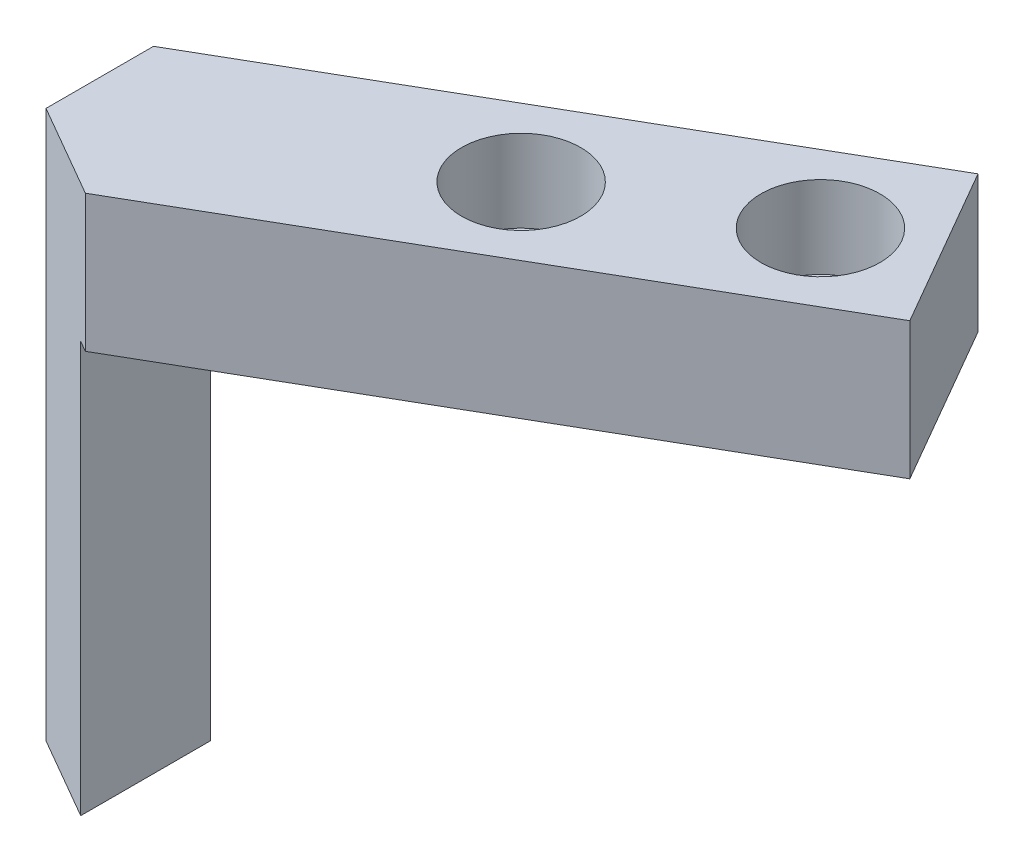
ISO-10303-21;
HEADER;
FILE_DESCRIPTION(('STEP AP214'),'2;1');
FILE_NAME('part.step','',(''),(''),'','','');
FILE_SCHEMA(('AUTOMOTIVE_DESIGN { 1 0 10303 214 1 1 1 1 }'));
ENDSEC;
DATA;
#1=APPLICATION_CONTEXT('core data for automotive mechanical design processes');
#2=APPLICATION_PROTOCOL_DEFINITION('international standard','automotive_design',2000,#1);
#3=PRODUCT_CONTEXT('',#1,'mechanical');
#4=PRODUCT('Part','Part','',(#3));
#5=PRODUCT_RELATED_PRODUCT_CATEGORY('part','',(#4));
#6=PRODUCT_DEFINITION_FORMATION('','',#4);
#7=PRODUCT_DEFINITION_CONTEXT('part definition',#1,'design');
#8=PRODUCT_DEFINITION('design','',#6,#7);
#9=PRODUCT_DEFINITION_SHAPE('','',#8);
#10=(LENGTH_UNIT() NAMED_UNIT(*) SI_UNIT(.MILLI.,.METRE.));
#11=(NAMED_UNIT(*) PLANE_ANGLE_UNIT() SI_UNIT($,.RADIAN.));
#12=(NAMED_UNIT(*) SI_UNIT($,.STERADIAN.) SOLID_ANGLE_UNIT());
#13=UNCERTAINTY_MEASURE_WITH_UNIT(LENGTH_MEASURE(1.E-05),#10,'distance_accuracy_value','');
#14=(GEOMETRIC_REPRESENTATION_CONTEXT(3) GLOBAL_UNCERTAINTY_ASSIGNED_CONTEXT((#13)) GLOBAL_UNIT_ASSIGNED_CONTEXT((#10,
#11,#12)) REPRESENTATION_CONTEXT('',''));
#15=CARTESIAN_POINT('',(0.,0.,0.));
#16=DIRECTION('',(0.,0.,1.));
#17=DIRECTION('',(1.,0.,0.));
#18=AXIS2_PLACEMENT_3D('',#15,#16,#17);
#19=CARTESIAN_POINT('',(0.,-5.,0.));
#20=DIRECTION('',(0.,1.,0.));
#21=DIRECTION('',(0.,0.,1.));
#22=AXIS2_PLACEMENT_3D('',#19,#20,#21);
#23=PLANE('',#22);
#24=CARTESIAN_POINT('',(17.9267258583379,-5.,-10.35));
#25=DIRECTION('',(0.,1.,0.));
#26=DIRECTION('',(0.,0.,1.));
#27=AXIS2_PLACEMENT_3D('',#24,#25,#26);
#28=CIRCLE('',#27,1.17500000000001);
#29=CARTESIAN_POINT('',(17.9267258583379,-5.,-9.17499999999999));
#30=VERTEX_POINT('',#29);
#31=EDGE_CURVE('E39',#30,#30,#28,.T.);
#32=ORIENTED_EDGE('',*,*,#31,.T.);
#33=EDGE_LOOP('',(#32));
#34=FACE_BOUND('',#33,.T.);
#35=CARTESIAN_POINT('',(10.9985226280624,-5.,-6.35));
#36=DIRECTION('',(0.,1.,0.));
#37=DIRECTION('',(0.,0.,1.));
#38=AXIS2_PLACEMENT_3D('',#35,#36,#37);
#39=CIRCLE('',#38,1.17500000000001);
#40=CARTESIAN_POINT('',(10.9985226280624,-5.,-5.17499999999999));
#41=VERTEX_POINT('',#40);
#42=EDGE_CURVE('E138',#41,#41,#39,.T.);
#43=ORIENTED_EDGE('',*,*,#42,.T.);
#44=EDGE_LOOP('',(#43));
#45=FACE_BOUND('',#44,.T.);
#46=DIRECTION('',(0.,0.,1.));
#47=VECTOR('',#46,1.);
#48=CARTESIAN_POINT('',(3.,-5.,1.73205080756885));
#49=LINE('',#48,#47);
#50=CARTESIAN_POINT('',(3.,-5.,-2.99794919243115));
#51=VERTEX_POINT('',#50);
#52=CARTESIAN_POINT('',(3.,-5.,1.73205080756889));
#53=VERTEX_POINT('',#52);
#54=EDGE_CURVE('E128',#51,#53,#49,.T.);
#55=ORIENTED_EDGE('',*,*,#54,.F.);
#56=DIRECTION('',(1.,0.,0.));
#57=VECTOR('',#56,1.);
#58=CARTESIAN_POINT('',(3.,-5.,-2.99794919243115));
#59=LINE('',#58,#57);
#60=CARTESIAN_POINT('',(0.,-5.,-2.99794919243115));
#61=VERTEX_POINT('',#60);
#62=EDGE_CURVE('E52',#61,#51,#59,.T.);
#63=ORIENTED_EDGE('',*,*,#62,.F.);
#64=DIRECTION('',(0.,0.,-1.));
#65=VECTOR('',#64,1.);
#66=CARTESIAN_POINT('',(0.,-5.,0.));
#67=LINE('',#66,#65);
#68=CARTESIAN_POINT('',(0.,-5.,-3.92598183048946));
#69=VERTEX_POINT('',#68);
#70=EDGE_CURVE('E161',#61,#69,#67,.T.);
#71=ORIENTED_EDGE('',*,*,#70,.T.);
#72=DIRECTION('',(0.866025403784438,0.,-0.500000000000001));
#73=VECTOR('',#72,1.);
#74=CARTESIAN_POINT('',(0.,-5.,-3.92598183048946));
#75=LINE('',#74,#73);
#76=CARTESIAN_POINT('',(19.0846096908265,-5.,-14.9444863728671));
#77=VERTEX_POINT('',#76);
#78=EDGE_CURVE('E163',#69,#77,#75,.T.);
#79=ORIENTED_EDGE('',*,*,#78,.T.);
#80=DIRECTION('',(0.500000000000001,0.,0.866025403784438));
#81=VECTOR('',#80,1.);
#82=CARTESIAN_POINT('',(19.0846096908265,-5.,-14.9444863728671));
#83=LINE('',#82,#81);
#84=CARTESIAN_POINT('',(22.4846096908265,-5.,-9.05551362713293));
#85=VERTEX_POINT('',#84);
#86=EDGE_CURVE('E149',#77,#85,#83,.T.);
#87=ORIENTED_EDGE('',*,*,#86,.T.);
#88=DIRECTION('',(-0.866025403784438,0.,0.500000000000002));
#89=VECTOR('',#88,1.);
#90=CARTESIAN_POINT('',(22.4846096908265,-5.,-9.05551362713293));
#91=LINE('',#90,#89);
#92=CARTESIAN_POINT('',(3.4,-5.,1.96299091524474));
#93=VERTEX_POINT('',#92);
#94=EDGE_CURVE('E145',#85,#93,#91,.T.);
#95=ORIENTED_EDGE('',*,*,#94,.T.);
#96=DIRECTION('',(-0.866025403784437,0.,-0.500000000000002));
#97=VECTOR('',#96,1.);
#98=CARTESIAN_POINT('',(3.4,-5.,1.96299091524474));
#99=LINE('',#98,#97);
#100=EDGE_CURVE('E58',#93,#53,#99,.T.);
#101=ORIENTED_EDGE('',*,*,#100,.T.);
#102=EDGE_LOOP('',(#55,#63,#71,#79,#87,#95,#101));
#103=FACE_BOUND('',#102,.T.);
#104=ADVANCED_FACE('F35',(#34,#45,#103),#23,.F.);
#105=CARTESIAN_POINT('',(22.4846096908265,0.,-9.05551362713293));
#106=DIRECTION('',(0.500000000000002,0.,0.866025403784438));
#107=DIRECTION('',(0.866025403784438,0.,-0.500000000000002));
#108=AXIS2_PLACEMENT_3D('',#105,#106,#107);
#109=PLANE('',#108);
#110=ORIENTED_EDGE('',*,*,#94,.F.);
#111=DIRECTION('',(0.,-1.,0.));
#112=VECTOR('',#111,1.);
#113=CARTESIAN_POINT('',(22.4846096908265,0.,-9.05551362713293));
#114=LINE('',#113,#112);
#115=CARTESIAN_POINT('',(22.4846096908265,0.,-9.05551362713293));
#116=VERTEX_POINT('',#115);
#117=EDGE_CURVE('E11',#116,#85,#114,.T.);
#118=ORIENTED_EDGE('',*,*,#117,.F.);
#119=DIRECTION('',(-0.866025403784438,0.,0.500000000000002));
#120=VECTOR('',#119,1.);
#121=CARTESIAN_POINT('',(22.4846096908265,0.,-9.05551362713293));
#122=LINE('',#121,#120);
#123=CARTESIAN_POINT('',(3.4,0.,1.96299091524474));
#124=VERTEX_POINT('',#123);
#125=EDGE_CURVE('E146',#116,#124,#122,.T.);
#126=ORIENTED_EDGE('',*,*,#125,.T.);
#127=DIRECTION('',(0.,-1.,0.));
#128=VECTOR('',#127,1.);
#129=CARTESIAN_POINT('',(3.4,0.,1.96299091524474));
#130=LINE('',#129,#128);
#131=EDGE_CURVE('E113',#124,#93,#130,.T.);
#132=ORIENTED_EDGE('',*,*,#131,.T.);
#133=EDGE_LOOP('',(#110,#118,#126,#132));
#134=FACE_BOUND('',#133,.T.);
#135=ADVANCED_FACE('F37',(#134),#109,.T.);
#136=CARTESIAN_POINT('',(19.0846096908265,0.,-14.9444863728671));
#137=DIRECTION('',(0.866025403784438,0.,-0.500000000000001));
#138=DIRECTION('',(-0.500000000000001,0.,-0.866025403784438));
#139=AXIS2_PLACEMENT_3D('',#136,#137,#138);
#140=PLANE('',#139);
#141=ORIENTED_EDGE('',*,*,#86,.F.);
#142=DIRECTION('',(0.,-1.,0.));
#143=VECTOR('',#142,1.);
#144=CARTESIAN_POINT('',(19.0846096908265,0.,-14.9444863728671));
#145=LINE('',#144,#143);
#146=CARTESIAN_POINT('',(19.0846096908265,0.,-14.9444863728671));
#147=VERTEX_POINT('',#146);
#148=EDGE_CURVE('E44',#147,#77,#145,.T.);
#149=ORIENTED_EDGE('',*,*,#148,.F.);
#150=DIRECTION('',(0.500000000000001,0.,0.866025403784438));
#151=VECTOR('',#150,1.);
#152=CARTESIAN_POINT('',(19.0846096908265,0.,-14.9444863728671));
#153=LINE('',#152,#151);
#154=EDGE_CURVE('E156',#147,#116,#153,.T.);
#155=ORIENTED_EDGE('',*,*,#154,.T.);
#156=ORIENTED_EDGE('',*,*,#117,.T.);
#157=EDGE_LOOP('',(#141,#149,#155,#156));
#158=FACE_BOUND('',#157,.T.);
#159=ADVANCED_FACE('F210',(#158),#140,.T.);
#160=CARTESIAN_POINT('',(0.,0.,-3.92598183048946));
#161=DIRECTION('',(-0.500000000000001,0.,-0.866025403784438));
#162=DIRECTION('',(-0.866025403784438,0.,0.500000000000001));
#163=AXIS2_PLACEMENT_3D('',#160,#161,#162);
#164=PLANE('',#163);
#165=ORIENTED_EDGE('',*,*,#78,.F.);
#166=DIRECTION('',(0.,-1.,0.));
#167=VECTOR('',#166,1.);
#168=CARTESIAN_POINT('',(0.,0.,-3.92598183048946));
#169=LINE('',#168,#167);
#170=CARTESIAN_POINT('',(0.,0.,-3.92598183048946));
#171=VERTEX_POINT('',#170);
#172=EDGE_CURVE('E112',#171,#69,#169,.T.);
#173=ORIENTED_EDGE('',*,*,#172,.F.);
#174=DIRECTION('',(0.866025403784438,0.,-0.500000000000001));
#175=VECTOR('',#174,1.);
#176=CARTESIAN_POINT('',(0.,0.,-3.92598183048946));
#177=LINE('',#176,#175);
#178=EDGE_CURVE('E153',#171,#147,#177,.T.);
#179=ORIENTED_EDGE('',*,*,#178,.T.);
#180=ORIENTED_EDGE('',*,*,#148,.T.);
#181=EDGE_LOOP('',(#165,#173,#179,#180));
#182=FACE_BOUND('',#181,.T.);
#183=ADVANCED_FACE('F214',(#182),#164,.T.);
#184=CARTESIAN_POINT('',(0.,0.,0.));
#185=DIRECTION('',(-1.,0.,0.));
#186=DIRECTION('',(0.,0.,1.));
#187=AXIS2_PLACEMENT_3D('',#184,#185,#186);
#188=PLANE('',#187);
#189=ORIENTED_EDGE('',*,*,#70,.F.);
#190=DIRECTION('',(0.,1.,0.));
#191=VECTOR('',#190,1.);
#192=CARTESIAN_POINT('',(0.,-20.,-2.99794919243115));
#193=LINE('',#192,#191);
#194=CARTESIAN_POINT('',(0.,-20.,-2.99794919243115));
#195=VERTEX_POINT('',#194);
#196=EDGE_CURVE('E119',#195,#61,#193,.T.);
#197=ORIENTED_EDGE('',*,*,#196,.F.);
#198=DIRECTION('',(0.,0.,-1.));
#199=VECTOR('',#198,1.);
#200=CARTESIAN_POINT('',(0.,-20.,-2.99794919243115));
#201=LINE('',#200,#199);
#202=CARTESIAN_POINT('',(0.,-20.,0.));
#203=VERTEX_POINT('',#202);
#204=EDGE_CURVE('E116',#203,#195,#201,.T.);
#205=ORIENTED_EDGE('',*,*,#204,.F.);
#206=DIRECTION('',(0.,-1.,0.));
#207=VECTOR('',#206,1.);
#208=CARTESIAN_POINT('',(0.,0.,0.));
#209=LINE('',#208,#207);
#210=CARTESIAN_POINT('',(0.,0.,0.));
#211=VERTEX_POINT('',#210);
#212=EDGE_CURVE('E101',#211,#203,#209,.T.);
#213=ORIENTED_EDGE('',*,*,#212,.F.);
#214=DIRECTION('',(0.,0.,-1.));
#215=VECTOR('',#214,1.);
#216=CARTESIAN_POINT('',(0.,0.,0.));
#217=LINE('',#216,#215);
#218=EDGE_CURVE('E151',#211,#171,#217,.T.);
#219=ORIENTED_EDGE('',*,*,#218,.T.);
#220=ORIENTED_EDGE('',*,*,#172,.T.);
#221=EDGE_LOOP('',(#189,#197,#205,#213,#219,#220));
#222=FACE_BOUND('',#221,.T.);
#223=ADVANCED_FACE('F117',(#222),#188,.T.);
#224=CARTESIAN_POINT('',(3.4,0.,1.96299091524474));
#225=DIRECTION('',(-0.500000000000002,0.,0.866025403784437));
#226=DIRECTION('',(0.866025403784437,0.,0.500000000000002));
#227=AXIS2_PLACEMENT_3D('',#224,#225,#226);
#228=PLANE('',#227);
#229=ORIENTED_EDGE('',*,*,#100,.F.);
#230=ORIENTED_EDGE('',*,*,#131,.F.);
#231=DIRECTION('',(-0.866025403784437,0.,-0.500000000000002));
#232=VECTOR('',#231,1.);
#233=CARTESIAN_POINT('',(3.4,0.,1.96299091524474));
#234=LINE('',#233,#232);
#235=EDGE_CURVE('E108',#124,#211,#234,.T.);
#236=ORIENTED_EDGE('',*,*,#235,.T.);
#237=ORIENTED_EDGE('',*,*,#212,.T.);
#238=DIRECTION('',(-0.866025403784442,0.,-0.499999999999994));
#239=VECTOR('',#238,1.);
#240=CARTESIAN_POINT('',(0.,-20.,0.));
#241=LINE('',#240,#239);
#242=CARTESIAN_POINT('',(3.,-20.,1.73205080756885));
#243=VERTEX_POINT('',#242);
#244=EDGE_CURVE('E106',#243,#203,#241,.T.);
#245=ORIENTED_EDGE('',*,*,#244,.F.);
#246=DIRECTION('',(0.,1.,0.));
#247=VECTOR('',#246,1.);
#248=CARTESIAN_POINT('',(3.,-20.,1.73205080756885));
#249=LINE('',#248,#247);
#250=EDGE_CURVE('E137',#243,#53,#249,.T.);
#251=ORIENTED_EDGE('',*,*,#250,.T.);
#252=EDGE_LOOP('',(#229,#230,#236,#237,#245,#251));
#253=FACE_BOUND('',#252,.T.);
#254=ADVANCED_FACE('F103',(#253),#228,.T.);
#255=CARTESIAN_POINT('',(0.,0.,0.));
#256=DIRECTION('',(0.,1.,0.));
#257=DIRECTION('',(0.,0.,1.));
#258=AXIS2_PLACEMENT_3D('',#255,#256,#257);
#259=PLANE('',#258);
#260=CARTESIAN_POINT('',(17.9267258583379,0.,-10.35));
#261=DIRECTION('',(0.,1.,0.));
#262=DIRECTION('',(0.,0.,1.));
#263=AXIS2_PLACEMENT_3D('',#260,#261,#262);
#264=CIRCLE('',#263,2.17499999999999);
#265=CARTESIAN_POINT('',(17.9267258583379,0.,-8.17500000000001));
#266=VERTEX_POINT('',#265);
#267=EDGE_CURVE('E191',#266,#266,#264,.T.);
#268=ORIENTED_EDGE('',*,*,#267,.F.);
#269=EDGE_LOOP('',(#268));
#270=FACE_BOUND('',#269,.T.);
#271=CARTESIAN_POINT('',(10.9985226280624,0.,-6.35));
#272=DIRECTION('',(0.,1.,0.));
#273=DIRECTION('',(0.,0.,1.));
#274=AXIS2_PLACEMENT_3D('',#271,#272,#273);
#275=CIRCLE('',#274,2.17499999999999);
#276=CARTESIAN_POINT('',(10.9985226280624,0.,-4.17500000000001));
#277=VERTEX_POINT('',#276);
#278=EDGE_CURVE('E179',#277,#277,#275,.T.);
#279=ORIENTED_EDGE('',*,*,#278,.F.);
#280=EDGE_LOOP('',(#279));
#281=FACE_BOUND('',#280,.T.);
#282=ORIENTED_EDGE('',*,*,#125,.F.);
#283=ORIENTED_EDGE('',*,*,#154,.F.);
#284=ORIENTED_EDGE('',*,*,#178,.F.);
#285=ORIENTED_EDGE('',*,*,#218,.F.);
#286=ORIENTED_EDGE('',*,*,#235,.F.);
#287=EDGE_LOOP('',(#282,#283,#284,#285,#286));
#288=FACE_BOUND('',#287,.T.);
#289=ADVANCED_FACE('F197',(#270,#281,#288),#259,.T.);
#290=CARTESIAN_POINT('',(3.,-20.,-2.99794919243115));
#291=DIRECTION('',(0.,0.,1.));
#292=DIRECTION('',(1.,0.,0.));
#293=AXIS2_PLACEMENT_3D('',#290,#291,#292);
#294=PLANE('',#293);
#295=ORIENTED_EDGE('',*,*,#62,.T.);
#296=DIRECTION('',(0.,1.,0.));
#297=VECTOR('',#296,1.);
#298=CARTESIAN_POINT('',(3.,-20.,-2.99794919243115));
#299=LINE('',#298,#297);
#300=CARTESIAN_POINT('',(3.,-20.,-2.99794919243115));
#301=VERTEX_POINT('',#300);
#302=EDGE_CURVE('E141',#301,#51,#299,.T.);
#303=ORIENTED_EDGE('',*,*,#302,.F.);
#304=DIRECTION('',(1.,0.,0.));
#305=VECTOR('',#304,1.);
#306=CARTESIAN_POINT('',(3.,-20.,-2.99794919243115));
#307=LINE('',#306,#305);
#308=EDGE_CURVE('E122',#195,#301,#307,.T.);
#309=ORIENTED_EDGE('',*,*,#308,.F.);
#310=ORIENTED_EDGE('',*,*,#196,.T.);
#311=EDGE_LOOP('',(#295,#303,#309,#310));
#312=FACE_BOUND('',#311,.T.);
#313=ADVANCED_FACE('F200',(#312),#294,.F.);
#314=CARTESIAN_POINT('',(3.,-20.,1.73205080756885));
#315=DIRECTION('',(-1.,0.,0.));
#316=DIRECTION('',(0.,0.,1.));
#317=AXIS2_PLACEMENT_3D('',#314,#315,#316);
#318=PLANE('',#317);
#319=ORIENTED_EDGE('',*,*,#54,.T.);
#320=ORIENTED_EDGE('',*,*,#250,.F.);
#321=DIRECTION('',(0.,0.,1.));
#322=VECTOR('',#321,1.);
#323=CARTESIAN_POINT('',(3.,-20.,1.73205080756885));
#324=LINE('',#323,#322);
#325=EDGE_CURVE('E126',#301,#243,#324,.T.);
#326=ORIENTED_EDGE('',*,*,#325,.F.);
#327=ORIENTED_EDGE('',*,*,#302,.T.);
#328=EDGE_LOOP('',(#319,#320,#326,#327));
#329=FACE_BOUND('',#328,.T.);
#330=ADVANCED_FACE('F216',(#329),#318,.F.);
#331=CARTESIAN_POINT('',(0.,-20.,0.));
#332=DIRECTION('',(0.,1.,0.));
#333=DIRECTION('',(0.,0.,1.));
#334=AXIS2_PLACEMENT_3D('',#331,#332,#333);
#335=PLANE('',#334);
#336=ORIENTED_EDGE('',*,*,#244,.T.);
#337=ORIENTED_EDGE('',*,*,#204,.T.);
#338=ORIENTED_EDGE('',*,*,#308,.T.);
#339=ORIENTED_EDGE('',*,*,#325,.T.);
#340=EDGE_LOOP('',(#336,#337,#338,#339));
#341=FACE_BOUND('',#340,.T.);
#342=ADVANCED_FACE('F124',(#341),#335,.F.);
#343=CARTESIAN_POINT('',(10.9985226280624,0.,-6.35));
#344=DIRECTION('',(0.,1.,0.));
#345=DIRECTION('',(0.,0.,1.));
#346=AXIS2_PLACEMENT_3D('',#343,#344,#345);
#347=CYLINDRICAL_SURFACE('',#346,1.17500000000001);
#348=CARTESIAN_POINT('',(10.9985226280624,-3.,-6.35));
#349=DIRECTION('',(0.,1.,0.));
#350=DIRECTION('',(0.,0.,1.));
#351=AXIS2_PLACEMENT_3D('',#348,#349,#350);
#352=CIRCLE('',#351,1.17500000000001);
#353=CARTESIAN_POINT('',(10.9985226280624,-3.,-5.17499999999999));
#354=VERTEX_POINT('',#353);
#355=EDGE_CURVE('E132',#354,#354,#352,.T.);
#356=ORIENTED_EDGE('',*,*,#355,.T.);
#357=EDGE_LOOP('',(#356));
#358=FACE_BOUND('',#357,.T.);
#359=ORIENTED_EDGE('',*,*,#42,.F.);
#360=EDGE_LOOP('',(#359));
#361=FACE_BOUND('',#360,.T.);
#362=ADVANCED_FACE('F256',(#358,#361),#347,.F.);
#363=CARTESIAN_POINT('',(12.1735226280624,-3.,-6.35));
#364=DIRECTION('',(0.,-1.,0.));
#365=DIRECTION('',(0.,0.,-1.));
#366=AXIS2_PLACEMENT_3D('',#363,#364,#365);
#367=PLANE('',#366);
#368=ORIENTED_EDGE('',*,*,#355,.F.);
#369=EDGE_LOOP('',(#368));
#370=FACE_BOUND('',#369,.T.);
#371=CARTESIAN_POINT('',(10.9985226280624,-3.,-6.35));
#372=DIRECTION('',(0.,1.,0.));
#373=DIRECTION('',(0.,0.,1.));
#374=AXIS2_PLACEMENT_3D('',#371,#372,#373);
#375=CIRCLE('',#374,2.17499999999999);
#376=CARTESIAN_POINT('',(10.9985226280624,-3.,-4.17500000000001));
#377=VERTEX_POINT('',#376);
#378=EDGE_CURVE('E175',#377,#377,#375,.T.);
#379=ORIENTED_EDGE('',*,*,#378,.T.);
#380=EDGE_LOOP('',(#379));
#381=FACE_BOUND('',#380,.T.);
#382=ADVANCED_FACE('F261',(#370,#381),#367,.F.);
#383=CARTESIAN_POINT('',(10.9985226280624,0.,-6.35));
#384=DIRECTION('',(0.,1.,0.));
#385=DIRECTION('',(0.,0.,1.));
#386=AXIS2_PLACEMENT_3D('',#383,#384,#385);
#387=CYLINDRICAL_SURFACE('',#386,2.17499999999999);
#388=ORIENTED_EDGE('',*,*,#378,.F.);
#389=EDGE_LOOP('',(#388));
#390=FACE_BOUND('',#389,.T.);
#391=ORIENTED_EDGE('',*,*,#278,.T.);
#392=EDGE_LOOP('',(#391));
#393=FACE_BOUND('',#392,.T.);
#394=ADVANCED_FACE('F272',(#390,#393),#387,.F.);
#395=CARTESIAN_POINT('',(17.9267258583379,0.,-10.35));
#396=DIRECTION('',(0.,1.,0.));
#397=DIRECTION('',(0.,0.,1.));
#398=AXIS2_PLACEMENT_3D('',#395,#396,#397);
#399=CYLINDRICAL_SURFACE('',#398,1.17500000000001);
#400=CARTESIAN_POINT('',(17.9267258583379,-3.,-10.35));
#401=DIRECTION('',(0.,1.,0.));
#402=DIRECTION('',(0.,0.,1.));
#403=AXIS2_PLACEMENT_3D('',#400,#401,#402);
#404=CIRCLE('',#403,1.17500000000001);
#405=CARTESIAN_POINT('',(17.9267258583379,-3.,-9.17499999999999));
#406=VERTEX_POINT('',#405);
#407=EDGE_CURVE('E185',#406,#406,#404,.T.);
#408=ORIENTED_EDGE('',*,*,#407,.T.);
#409=EDGE_LOOP('',(#408));
#410=FACE_BOUND('',#409,.T.);
#411=ORIENTED_EDGE('',*,*,#31,.F.);
#412=EDGE_LOOP('',(#411));
#413=FACE_BOUND('',#412,.T.);
#414=ADVANCED_FACE('F282',(#410,#413),#399,.F.);
#415=CARTESIAN_POINT('',(19.1017258583379,-3.,-10.35));
#416=DIRECTION('',(0.,-1.,0.));
#417=DIRECTION('',(0.,0.,-1.));
#418=AXIS2_PLACEMENT_3D('',#415,#416,#417);
#419=PLANE('',#418);
#420=ORIENTED_EDGE('',*,*,#407,.F.);
#421=EDGE_LOOP('',(#420));
#422=FACE_BOUND('',#421,.T.);
#423=CARTESIAN_POINT('',(17.9267258583379,-3.,-10.35));
#424=DIRECTION('',(0.,1.,0.));
#425=DIRECTION('',(0.,0.,1.));
#426=AXIS2_PLACEMENT_3D('',#423,#424,#425);
#427=CIRCLE('',#426,2.17499999999999);
#428=CARTESIAN_POINT('',(17.9267258583379,-3.,-8.17500000000001));
#429=VERTEX_POINT('',#428);
#430=EDGE_CURVE('E188',#429,#429,#427,.T.);
#431=ORIENTED_EDGE('',*,*,#430,.T.);
#432=EDGE_LOOP('',(#431));
#433=FACE_BOUND('',#432,.T.);
#434=ADVANCED_FACE('F292',(#422,#433),#419,.F.);
#435=CARTESIAN_POINT('',(17.9267258583379,0.,-10.35));
#436=DIRECTION('',(0.,1.,0.));
#437=DIRECTION('',(0.,0.,1.));
#438=AXIS2_PLACEMENT_3D('',#435,#436,#437);
#439=CYLINDRICAL_SURFACE('',#438,2.17499999999999);
#440=ORIENTED_EDGE('',*,*,#430,.F.);
#441=EDGE_LOOP('',(#440));
#442=FACE_BOUND('',#441,.T.);
#443=ORIENTED_EDGE('',*,*,#267,.T.);
#444=EDGE_LOOP('',(#443));
#445=FACE_BOUND('',#444,.T.);
#446=ADVANCED_FACE('F195',(#442,#445),#439,.F.);
#447=CLOSED_SHELL('',(#104,#135,#159,#183,#223,#254,#289,#313,#330,#342,#362,#382,#394,#414,
#434,#446));
#448=MANIFOLD_SOLID_BREP('B2',#447);
#449=ADVANCED_BREP_SHAPE_REPRESENTATION('',(#18,#448),#14);
#450=SHAPE_DEFINITION_REPRESENTATION(#9,#449);
ENDSEC;
END-ISO-10303-21;
